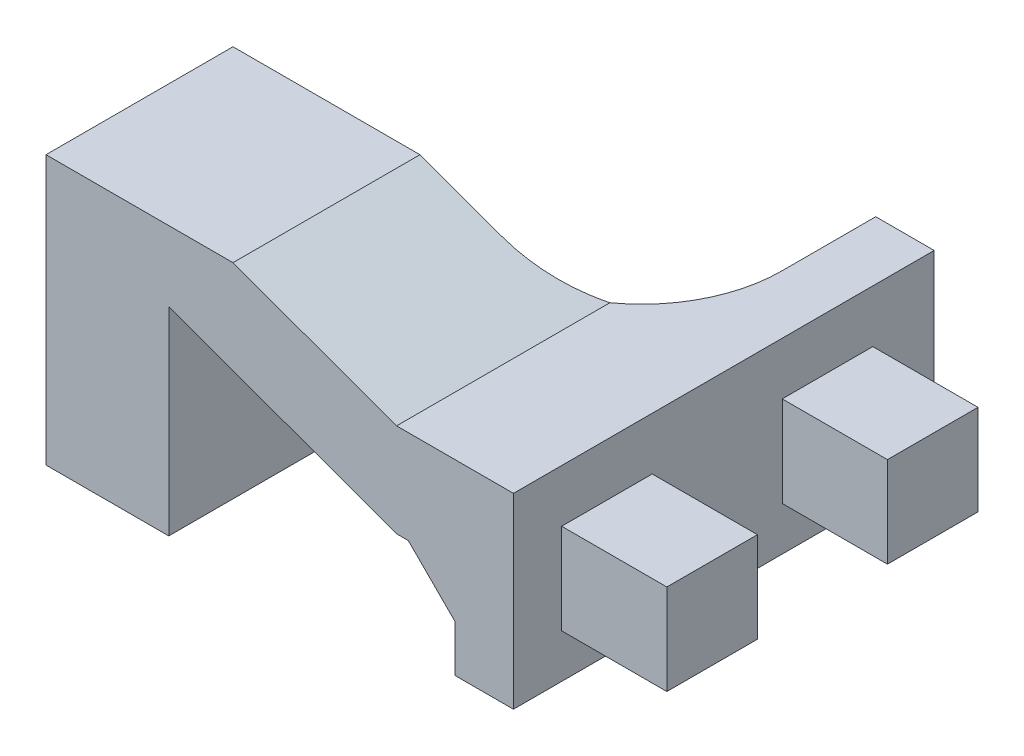
ISO-10303-21;
HEADER;
FILE_DESCRIPTION(('STEP AP214'),'2;1');
FILE_NAME('part.step','',(''),(''),'','','');
FILE_SCHEMA(('AUTOMOTIVE_DESIGN { 1 0 10303 214 1 1 1 1 }'));
ENDSEC;
DATA;
#1=APPLICATION_CONTEXT('core data for automotive mechanical design processes');
#2=APPLICATION_PROTOCOL_DEFINITION('international standard','automotive_design',2000,#1);
#3=PRODUCT_CONTEXT('',#1,'mechanical');
#4=PRODUCT('Part','Part','',(#3));
#5=PRODUCT_RELATED_PRODUCT_CATEGORY('part','',(#4));
#6=PRODUCT_DEFINITION_FORMATION('','',#4);
#7=PRODUCT_DEFINITION_CONTEXT('part definition',#1,'design');
#8=PRODUCT_DEFINITION('design','',#6,#7);
#9=PRODUCT_DEFINITION_SHAPE('','',#8);
#10=(LENGTH_UNIT() NAMED_UNIT(*) SI_UNIT(.MILLI.,.METRE.));
#11=(NAMED_UNIT(*) PLANE_ANGLE_UNIT() SI_UNIT($,.RADIAN.));
#12=(NAMED_UNIT(*) SI_UNIT($,.STERADIAN.) SOLID_ANGLE_UNIT());
#13=UNCERTAINTY_MEASURE_WITH_UNIT(LENGTH_MEASURE(1.E-05),#10,'distance_accuracy_value','');
#14=(GEOMETRIC_REPRESENTATION_CONTEXT(3) GLOBAL_UNCERTAINTY_ASSIGNED_CONTEXT((#13)) GLOBAL_UNIT_ASSIGNED_CONTEXT((#10,
#11,#12)) REPRESENTATION_CONTEXT('',''));
#15=CARTESIAN_POINT('',(0.,0.,0.));
#16=DIRECTION('',(0.,0.,1.));
#17=DIRECTION('',(1.,0.,0.));
#18=AXIS2_PLACEMENT_3D('',#15,#16,#17);
#19=CARTESIAN_POINT('',(0.,0.,-4.));
#20=DIRECTION('',(0.,0.,1.));
#21=DIRECTION('',(1.,0.,0.));
#22=AXIS2_PLACEMENT_3D('',#19,#20,#21);
#23=PLANE('',#22);
#24=DIRECTION('',(-0.939692620785908,0.34202014332567,0.));
#25=VECTOR('',#24,1.);
#26=CARTESIAN_POINT('',(3.11113986349505,8.54778652371776,-4.));
#27=LINE('',#26,#25);
#28=CARTESIAN_POINT('',(-8.5,12.7738958199317,-4.));
#29=VERTEX_POINT('',#28);
#30=CARTESIAN_POINT('',(-12.,14.0477916398634,-4.));
#31=VERTEX_POINT('',#30);
#32=EDGE_CURVE('E428',#29,#31,#27,.T.);
#33=ORIENTED_EDGE('',*,*,#32,.F.);
#34=DIRECTION('',(0.,1.,0.));
#35=VECTOR('',#34,1.);
#36=CARTESIAN_POINT('',(-8.5,5.5,-4.));
#37=LINE('',#36,#35);
#38=CARTESIAN_POINT('',(-8.5,8.77389581993171,-4.));
#39=VERTEX_POINT('',#38);
#40=EDGE_CURVE('E493',#29,#39,#37,.F.);
#41=ORIENTED_EDGE('',*,*,#40,.T.);
#42=DIRECTION('',(0.939692620785908,-0.342020143325669,0.));
#43=VECTOR('',#42,1.);
#44=CARTESIAN_POINT('',(1.82556464412197,5.01569763747982,-4.));
#45=LINE('',#44,#43);
#46=CARTESIAN_POINT('',(-14.7474774194546,11.0477916398634,-4.));
#47=VERTEX_POINT('',#46);
#48=EDGE_CURVE('E424',#47,#39,#45,.T.);
#49=ORIENTED_EDGE('',*,*,#48,.F.);
#50=DIRECTION('',(0.,1.,0.));
#51=VECTOR('',#50,1.);
#52=CARTESIAN_POINT('',(-14.7474774194546,0.,-4.));
#53=LINE('',#52,#51);
#54=CARTESIAN_POINT('',(-14.7474774194546,2.54779163986342,-4.));
#55=VERTEX_POINT('',#54);
#56=EDGE_CURVE('E420',#55,#47,#53,.T.);
#57=ORIENTED_EDGE('',*,*,#56,.F.);
#58=DIRECTION('',(1.,0.,0.));
#59=VECTOR('',#58,1.);
#60=CARTESIAN_POINT('',(0.,2.54779163986342,-4.));
#61=LINE('',#60,#59);
#62=CARTESIAN_POINT('',(-20.,2.54779163986342,-4.));
#63=VERTEX_POINT('',#62);
#64=EDGE_CURVE('E415',#63,#55,#61,.T.);
#65=ORIENTED_EDGE('',*,*,#64,.F.);
#66=DIRECTION('',(0.,-1.,0.));
#67=VECTOR('',#66,1.);
#68=CARTESIAN_POINT('',(-20.,0.,-4.));
#69=LINE('',#68,#67);
#70=CARTESIAN_POINT('',(-20.,14.0477916398634,-4.));
#71=VERTEX_POINT('',#70);
#72=EDGE_CURVE('E411',#71,#63,#69,.T.);
#73=ORIENTED_EDGE('',*,*,#72,.F.);
#74=DIRECTION('',(-1.,0.,0.));
#75=VECTOR('',#74,1.);
#76=CARTESIAN_POINT('',(0.,14.0477916398634,-4.));
#77=LINE('',#76,#75);
#78=EDGE_CURVE('E431',#31,#71,#77,.T.);
#79=ORIENTED_EDGE('',*,*,#78,.F.);
#80=EDGE_LOOP('',(#33,#41,#49,#57,#65,#73,#79));
#81=FACE_BOUND('',#80,.T.);
#82=ADVANCED_FACE('F116',(#81),#23,.F.);
#83=CARTESIAN_POINT('',(0.,11.5,-4.));
#84=DIRECTION('',(0.,1.,0.));
#85=DIRECTION('',(0.,0.,1.));
#86=AXIS2_PLACEMENT_3D('',#83,#84,#85);
#87=PLANE('',#86);
#88=DIRECTION('',(0.,0.,1.));
#89=VECTOR('',#88,1.);
#90=CARTESIAN_POINT('',(-2.5,11.5,-14.));
#91=LINE('',#90,#89);
#92=CARTESIAN_POINT('',(-2.5,11.5,-14.));
#93=VERTEX_POINT('',#92);
#94=CARTESIAN_POINT('',(-2.5,11.5,-10.));
#95=VERTEX_POINT('',#94);
#96=EDGE_CURVE('E380',#93,#95,#91,.T.);
#97=ORIENTED_EDGE('',*,*,#96,.T.);
#98=CARTESIAN_POINT('',(-8.5,11.5,-10.));
#99=DIRECTION('',(0.,1.,0.));
#100=DIRECTION('',(0.,0.,1.));
#101=AXIS2_PLACEMENT_3D('',#98,#99,#100);
#102=CIRCLE('',#101,6.);
#103=CARTESIAN_POINT('',(-5.,11.5,-5.12660282759533));
#104=VERTEX_POINT('',#103);
#105=EDGE_CURVE('E496',#95,#104,#102,.F.);
#106=ORIENTED_EDGE('',*,*,#105,.T.);
#107=DIRECTION('',(0.,0.,1.));
#108=VECTOR('',#107,1.);
#109=CARTESIAN_POINT('',(-5.,11.5,-4.));
#110=LINE('',#109,#108);
#111=CARTESIAN_POINT('',(-5.,11.5,4.));
#112=VERTEX_POINT('',#111);
#113=EDGE_CURVE('E464',#104,#112,#110,.T.);
#114=ORIENTED_EDGE('',*,*,#113,.T.);
#115=DIRECTION('',(-1.,0.,0.));
#116=VECTOR('',#115,1.);
#117=CARTESIAN_POINT('',(0.,11.5,4.));
#118=LINE('',#117,#116);
#119=CARTESIAN_POINT('',(0.,11.5,4.));
#120=VERTEX_POINT('',#119);
#121=EDGE_CURVE('E398',#120,#112,#118,.T.);
#122=ORIENTED_EDGE('',*,*,#121,.F.);
#123=DIRECTION('',(0.,0.,1.));
#124=VECTOR('',#123,1.);
#125=CARTESIAN_POINT('',(0.,11.5,-4.));
#126=LINE('',#125,#124);
#127=CARTESIAN_POINT('',(0.,11.5,-14.));
#128=VERTEX_POINT('',#127);
#129=EDGE_CURVE('E402',#128,#120,#126,.T.);
#130=ORIENTED_EDGE('',*,*,#129,.F.);
#131=DIRECTION('',(-1.,0.,0.));
#132=VECTOR('',#131,1.);
#133=CARTESIAN_POINT('',(0.,11.5,-14.));
#134=LINE('',#133,#132);
#135=EDGE_CURVE('E376',#128,#93,#134,.T.);
#136=ORIENTED_EDGE('',*,*,#135,.T.);
#137=EDGE_LOOP('',(#97,#106,#114,#122,#130,#136));
#138=FACE_BOUND('',#137,.T.);
#139=ADVANCED_FACE('F528',(#138),#87,.T.);
#140=CARTESIAN_POINT('',(0.,0.,4.));
#141=DIRECTION('',(0.,0.,1.));
#142=DIRECTION('',(1.,0.,0.));
#143=AXIS2_PLACEMENT_3D('',#140,#141,#142);
#144=PLANE('',#143);
#145=DIRECTION('',(0.,1.,0.));
#146=VECTOR('',#145,1.);
#147=CARTESIAN_POINT('',(-2.5,0.,4.));
#148=LINE('',#147,#146);
#149=CARTESIAN_POINT('',(-2.5,3.5,4.));
#150=VERTEX_POINT('',#149);
#151=CARTESIAN_POINT('',(-2.5,5.5,4.));
#152=VERTEX_POINT('',#151);
#153=EDGE_CURVE('E385',#150,#152,#148,.T.);
#154=ORIENTED_EDGE('',*,*,#153,.F.);
#155=DIRECTION('',(1.,0.,0.));
#156=VECTOR('',#155,1.);
#157=CARTESIAN_POINT('',(0.,3.5,4.));
#158=LINE('',#157,#156);
#159=CARTESIAN_POINT('',(0.,3.5,4.));
#160=VERTEX_POINT('',#159);
#161=EDGE_CURVE('E389',#150,#160,#158,.T.);
#162=ORIENTED_EDGE('',*,*,#161,.T.);
#163=DIRECTION('',(0.,1.,0.));
#164=VECTOR('',#163,1.);
#165=CARTESIAN_POINT('',(0.,0.,4.));
#166=LINE('',#165,#164);
#167=EDGE_CURVE('E394',#160,#120,#166,.T.);
#168=ORIENTED_EDGE('',*,*,#167,.T.);
#169=ORIENTED_EDGE('',*,*,#121,.T.);
#170=DIRECTION('',(-0.939692620785908,0.34202014332567,0.));
#171=VECTOR('',#170,1.);
#172=CARTESIAN_POINT('',(3.11113986349505,8.54778652371776,4.));
#173=LINE('',#172,#171);
#174=CARTESIAN_POINT('',(-12.,14.0477916398634,4.));
#175=VERTEX_POINT('',#174);
#176=EDGE_CURVE('E452',#112,#175,#173,.T.);
#177=ORIENTED_EDGE('',*,*,#176,.T.);
#178=DIRECTION('',(-1.,0.,0.));
#179=VECTOR('',#178,1.);
#180=CARTESIAN_POINT('',(0.,14.0477916398634,4.));
#181=LINE('',#180,#179);
#182=CARTESIAN_POINT('',(-20.,14.0477916398634,4.));
#183=VERTEX_POINT('',#182);
#184=EDGE_CURVE('E416',#175,#183,#181,.T.);
#185=ORIENTED_EDGE('',*,*,#184,.T.);
#186=DIRECTION('',(0.,-1.,0.));
#187=VECTOR('',#186,1.);
#188=CARTESIAN_POINT('',(-20.,0.,4.));
#189=LINE('',#188,#187);
#190=CARTESIAN_POINT('',(-20.,2.54779163986342,4.));
#191=VERTEX_POINT('',#190);
#192=EDGE_CURVE('E436',#183,#191,#189,.T.);
#193=ORIENTED_EDGE('',*,*,#192,.T.);
#194=DIRECTION('',(1.,0.,0.));
#195=VECTOR('',#194,1.);
#196=CARTESIAN_POINT('',(0.,2.54779163986342,4.));
#197=LINE('',#196,#195);
#198=CARTESIAN_POINT('',(-14.7474774194546,2.54779163986342,4.));
#199=VERTEX_POINT('',#198);
#200=EDGE_CURVE('E440',#191,#199,#197,.T.);
#201=ORIENTED_EDGE('',*,*,#200,.T.);
#202=DIRECTION('',(0.,1.,0.));
#203=VECTOR('',#202,1.);
#204=CARTESIAN_POINT('',(-14.7474774194546,0.,4.));
#205=LINE('',#204,#203);
#206=CARTESIAN_POINT('',(-14.7474774194546,11.0477916398634,4.));
#207=VERTEX_POINT('',#206);
#208=EDGE_CURVE('E444',#199,#207,#205,.T.);
#209=ORIENTED_EDGE('',*,*,#208,.T.);
#210=DIRECTION('',(0.939692620785908,-0.342020143325669,0.));
#211=VECTOR('',#210,1.);
#212=CARTESIAN_POINT('',(1.82556464412197,5.01569763747982,4.));
#213=LINE('',#212,#211);
#214=CARTESIAN_POINT('',(-5.,7.5,4.));
#215=VERTEX_POINT('',#214);
#216=EDGE_CURVE('E448',#207,#215,#213,.T.);
#217=ORIENTED_EDGE('',*,*,#216,.T.);
#218=DIRECTION('',(1.,0.,0.));
#219=VECTOR('',#218,1.);
#220=CARTESIAN_POINT('',(-5.,7.5,4.));
#221=LINE('',#220,#219);
#222=CARTESIAN_POINT('',(-4.5,7.5,4.));
#223=VERTEX_POINT('',#222);
#224=EDGE_CURVE('E384',#215,#223,#221,.T.);
#225=ORIENTED_EDGE('',*,*,#224,.T.);
#226=DIRECTION('',(0.707106781186548,-0.707106781186548,0.));
#227=VECTOR('',#226,1.);
#228=CARTESIAN_POINT('',(-4.5,7.5,4.));
#229=LINE('',#228,#227);
#230=EDGE_CURVE('E481',#223,#152,#229,.T.);
#231=ORIENTED_EDGE('',*,*,#230,.T.);
#232=EDGE_LOOP('',(#154,#162,#168,#169,#177,#185,#193,#201,#209,#217,#225,#231));
#233=FACE_BOUND('',#232,.T.);
#234=ADVANCED_FACE('F516',(#233),#144,.T.);
#235=CARTESIAN_POINT('',(0.,0.,-4.));
#236=DIRECTION('',(1.,0.,0.));
#237=DIRECTION('',(0.,0.,-1.));
#238=AXIS2_PLACEMENT_3D('',#235,#236,#237);
#239=PLANE('',#238);
#240=DIRECTION('',(0.,1.,0.));
#241=VECTOR('',#240,1.);
#242=CARTESIAN_POINT('',(0.,0.,-7.5));
#243=LINE('',#242,#241);
#244=CARTESIAN_POINT('',(0.,5.375,-7.5));
#245=VERTEX_POINT('',#244);
#246=CARTESIAN_POINT('',(0.,9.25,-7.5));
#247=VERTEX_POINT('',#246);
#248=EDGE_CURVE('E287',#245,#247,#243,.T.);
#249=ORIENTED_EDGE('',*,*,#248,.T.);
#250=DIRECTION('',(0.,0.,-1.));
#251=VECTOR('',#250,1.);
#252=CARTESIAN_POINT('',(0.,9.25,-7.5));
#253=LINE('',#252,#251);
#254=CARTESIAN_POINT('',(0.,9.25,-11.375));
#255=VERTEX_POINT('',#254);
#256=EDGE_CURVE('E316',#247,#255,#253,.T.);
#257=ORIENTED_EDGE('',*,*,#256,.T.);
#258=DIRECTION('',(0.,1.,0.));
#259=VECTOR('',#258,1.);
#260=CARTESIAN_POINT('',(0.,0.,-11.375));
#261=LINE('',#260,#259);
#262=CARTESIAN_POINT('',(0.,5.375,-11.375));
#263=VERTEX_POINT('',#262);
#264=EDGE_CURVE('E290',#263,#255,#261,.T.);
#265=ORIENTED_EDGE('',*,*,#264,.F.);
#266=DIRECTION('',(0.,0.,-1.));
#267=VECTOR('',#266,1.);
#268=CARTESIAN_POINT('',(0.,5.375,-7.5));
#269=LINE('',#268,#267);
#270=EDGE_CURVE('E301',#245,#263,#269,.T.);
#271=ORIENTED_EDGE('',*,*,#270,.F.);
#272=EDGE_LOOP('',(#249,#257,#265,#271));
#273=FACE_BOUND('',#272,.T.);
#274=DIRECTION('',(0.,1.,0.));
#275=VECTOR('',#274,1.);
#276=CARTESIAN_POINT('',(0.,0.,1.9375));
#277=LINE('',#276,#275);
#278=CARTESIAN_POINT('',(0.,5.375,1.9375));
#279=VERTEX_POINT('',#278);
#280=CARTESIAN_POINT('',(0.,9.25,1.9375));
#281=VERTEX_POINT('',#280);
#282=EDGE_CURVE('E334',#279,#281,#277,.T.);
#283=ORIENTED_EDGE('',*,*,#282,.T.);
#284=DIRECTION('',(0.,0.,-1.));
#285=VECTOR('',#284,1.);
#286=CARTESIAN_POINT('',(0.,9.25,1.9375));
#287=LINE('',#286,#285);
#288=CARTESIAN_POINT('',(0.,9.25,-1.9375));
#289=VERTEX_POINT('',#288);
#290=EDGE_CURVE('E355',#281,#289,#287,.T.);
#291=ORIENTED_EDGE('',*,*,#290,.T.);
#292=DIRECTION('',(0.,1.,0.));
#293=VECTOR('',#292,1.);
#294=CARTESIAN_POINT('',(0.,0.,-1.9375));
#295=LINE('',#294,#293);
#296=CARTESIAN_POINT('',(0.,5.375,-1.9375));
#297=VERTEX_POINT('',#296);
#298=EDGE_CURVE('E326',#297,#289,#295,.T.);
#299=ORIENTED_EDGE('',*,*,#298,.F.);
#300=DIRECTION('',(0.,0.,-1.));
#301=VECTOR('',#300,1.);
#302=CARTESIAN_POINT('',(0.,5.375,1.9375));
#303=LINE('',#302,#301);
#304=EDGE_CURVE('E338',#279,#297,#303,.T.);
#305=ORIENTED_EDGE('',*,*,#304,.F.);
#306=EDGE_LOOP('',(#283,#291,#299,#305));
#307=FACE_BOUND('',#306,.T.);
#308=ORIENTED_EDGE('',*,*,#167,.F.);
#309=DIRECTION('',(0.,0.,1.));
#310=VECTOR('',#309,1.);
#311=CARTESIAN_POINT('',(0.,3.5,-4.));
#312=LINE('',#311,#310);
#313=CARTESIAN_POINT('',(0.,3.5,-14.));
#314=VERTEX_POINT('',#313);
#315=EDGE_CURVE('E406',#314,#160,#312,.T.);
#316=ORIENTED_EDGE('',*,*,#315,.F.);
#317=DIRECTION('',(0.,1.,0.));
#318=VECTOR('',#317,1.);
#319=CARTESIAN_POINT('',(0.,0.,-14.));
#320=LINE('',#319,#318);
#321=EDGE_CURVE('E372',#314,#128,#320,.T.);
#322=ORIENTED_EDGE('',*,*,#321,.T.);
#323=ORIENTED_EDGE('',*,*,#129,.T.);
#324=EDGE_LOOP('',(#308,#316,#322,#323));
#325=FACE_BOUND('',#324,.T.);
#326=ADVANCED_FACE('F563',(#273,#307,#325),#239,.T.);
#327=CARTESIAN_POINT('',(0.,3.5,-4.));
#328=DIRECTION('',(0.,-1.,0.));
#329=DIRECTION('',(0.,0.,-1.));
#330=AXIS2_PLACEMENT_3D('',#327,#328,#329);
#331=PLANE('',#330);
#332=ORIENTED_EDGE('',*,*,#161,.F.);
#333=DIRECTION('',(0.,0.,1.));
#334=VECTOR('',#333,1.);
#335=CARTESIAN_POINT('',(-2.5,3.5,-4.));
#336=LINE('',#335,#334);
#337=CARTESIAN_POINT('',(-2.5,3.5,-14.));
#338=VERTEX_POINT('',#337);
#339=EDGE_CURVE('E401',#338,#150,#336,.T.);
#340=ORIENTED_EDGE('',*,*,#339,.F.);
#341=DIRECTION('',(1.,0.,0.));
#342=VECTOR('',#341,1.);
#343=CARTESIAN_POINT('',(0.,3.5,-14.));
#344=LINE('',#343,#342);
#345=EDGE_CURVE('E368',#338,#314,#344,.T.);
#346=ORIENTED_EDGE('',*,*,#345,.T.);
#347=ORIENTED_EDGE('',*,*,#315,.T.);
#348=EDGE_LOOP('',(#332,#340,#346,#347));
#349=FACE_BOUND('',#348,.T.);
#350=ADVANCED_FACE('F523',(#349),#331,.T.);
#351=CARTESIAN_POINT('',(-2.5,0.,-4.));
#352=DIRECTION('',(1.,0.,0.));
#353=DIRECTION('',(0.,1.,0.));
#354=AXIS2_PLACEMENT_3D('',#351,#352,#353);
#355=PLANE('',#354);
#356=DIRECTION('',(0.,0.,1.));
#357=VECTOR('',#356,1.);
#358=CARTESIAN_POINT('',(-2.5,5.5,-4.));
#359=LINE('',#358,#357);
#360=CARTESIAN_POINT('',(-2.5,5.5,-10.));
#361=VERTEX_POINT('',#360);
#362=EDGE_CURVE('E405',#361,#152,#359,.T.);
#363=ORIENTED_EDGE('',*,*,#362,.F.);
#364=DIRECTION('',(0.,1.,0.));
#365=VECTOR('',#364,1.);
#366=CARTESIAN_POINT('',(-2.5,11.5,-10.));
#367=LINE('',#366,#365);
#368=EDGE_CURVE('E487',#361,#95,#367,.T.);
#369=ORIENTED_EDGE('',*,*,#368,.T.);
#370=ORIENTED_EDGE('',*,*,#96,.F.);
#371=DIRECTION('',(0.,1.,0.));
#372=VECTOR('',#371,1.);
#373=CARTESIAN_POINT('',(-2.5,0.,-14.));
#374=LINE('',#373,#372);
#375=EDGE_CURVE('E365',#338,#93,#374,.T.);
#376=ORIENTED_EDGE('',*,*,#375,.F.);
#377=ORIENTED_EDGE('',*,*,#339,.T.);
#378=ORIENTED_EDGE('',*,*,#153,.T.);
#379=EDGE_LOOP('',(#363,#369,#370,#376,#377,#378));
#380=FACE_BOUND('',#379,.T.);
#381=ADVANCED_FACE('F518',(#380),#355,.F.);
#382=CARTESIAN_POINT('',(0.,14.0477916398634,-4.));
#383=DIRECTION('',(0.,1.,0.));
#384=DIRECTION('',(-1.,0.,0.));
#385=AXIS2_PLACEMENT_3D('',#382,#383,#384);
#386=PLANE('',#385);
#387=ORIENTED_EDGE('',*,*,#184,.F.);
#388=DIRECTION('',(0.,0.,1.));
#389=VECTOR('',#388,1.);
#390=CARTESIAN_POINT('',(-12.,14.0477916398634,-4.));
#391=LINE('',#390,#389);
#392=EDGE_CURVE('E461',#31,#175,#391,.T.);
#393=ORIENTED_EDGE('',*,*,#392,.F.);
#394=ORIENTED_EDGE('',*,*,#78,.T.);
#395=DIRECTION('',(0.,0.,1.));
#396=VECTOR('',#395,1.);
#397=CARTESIAN_POINT('',(-20.,14.0477916398634,-4.));
#398=LINE('',#397,#396);
#399=EDGE_CURVE('E390',#71,#183,#398,.T.);
#400=ORIENTED_EDGE('',*,*,#399,.T.);
#401=EDGE_LOOP('',(#387,#393,#394,#400));
#402=FACE_BOUND('',#401,.T.);
#403=ADVANCED_FACE('F536',(#402),#386,.T.);
#404=CARTESIAN_POINT('',(1.82556464412197,5.01569763747982,-4.));
#405=DIRECTION('',(-0.342020143325669,-0.939692620785908,0.));
#406=DIRECTION('',(0.939692620785908,-0.342020143325669,0.));
#407=AXIS2_PLACEMENT_3D('',#404,#405,#406);
#408=PLANE('',#407);
#409=ORIENTED_EDGE('',*,*,#216,.F.);
#410=DIRECTION('',(0.,0.,1.));
#411=VECTOR('',#410,1.);
#412=CARTESIAN_POINT('',(-14.7474774194546,11.0477916398634,-4.));
#413=LINE('',#412,#411);
#414=EDGE_CURVE('E470',#47,#207,#413,.T.);
#415=ORIENTED_EDGE('',*,*,#414,.F.);
#416=ORIENTED_EDGE('',*,*,#48,.T.);
#417=CARTESIAN_POINT('',(-8.5,8.77389581993171,-10.));
#418=DIRECTION('',(-0.342020143325669,-0.939692620785908,0.));
#419=DIRECTION('',(0.939692620785908,-0.342020143325669,0.));
#420=AXIS2_PLACEMENT_3D('',#417,#418,#419);
#421=ELLIPSE('',#420,6.38506663485547,6.);
#422=CARTESIAN_POINT('',(-5.,7.5,-5.12660282759533));
#423=VERTEX_POINT('',#422);
#424=EDGE_CURVE('E503',#39,#423,#421,.F.);
#425=ORIENTED_EDGE('',*,*,#424,.T.);
#426=DIRECTION('',(0.,0.,1.));
#427=VECTOR('',#426,1.);
#428=CARTESIAN_POINT('',(-5.,7.5,-4.));
#429=LINE('',#428,#427);
#430=EDGE_CURVE('E138',#423,#215,#429,.T.);
#431=ORIENTED_EDGE('',*,*,#430,.T.);
#432=EDGE_LOOP('',(#409,#415,#416,#425,#431));
#433=FACE_BOUND('',#432,.T.);
#434=ADVANCED_FACE('F553',(#433),#408,.T.);
#435=CARTESIAN_POINT('',(-14.7474774194546,0.,-4.));
#436=DIRECTION('',(1.,0.,0.));
#437=DIRECTION('',(0.,1.,0.));
#438=AXIS2_PLACEMENT_3D('',#435,#436,#437);
#439=PLANE('',#438);
#440=ORIENTED_EDGE('',*,*,#208,.F.);
#441=DIRECTION('',(0.,0.,1.));
#442=VECTOR('',#441,1.);
#443=CARTESIAN_POINT('',(-14.7474774194546,2.54779163986342,-4.));
#444=LINE('',#443,#442);
#445=EDGE_CURVE('E473',#55,#199,#444,.T.);
#446=ORIENTED_EDGE('',*,*,#445,.F.);
#447=ORIENTED_EDGE('',*,*,#56,.T.);
#448=ORIENTED_EDGE('',*,*,#414,.T.);
#449=EDGE_LOOP('',(#440,#446,#447,#448));
#450=FACE_BOUND('',#449,.T.);
#451=ADVANCED_FACE('F549',(#450),#439,.T.);
#452=CARTESIAN_POINT('',(0.,2.54779163986342,-4.));
#453=DIRECTION('',(0.,-1.,0.));
#454=DIRECTION('',(0.,0.,-1.));
#455=AXIS2_PLACEMENT_3D('',#452,#453,#454);
#456=PLANE('',#455);
#457=ORIENTED_EDGE('',*,*,#200,.F.);
#458=DIRECTION('',(0.,0.,1.));
#459=VECTOR('',#458,1.);
#460=CARTESIAN_POINT('',(-20.,2.54779163986342,-4.));
#461=LINE('',#460,#459);
#462=EDGE_CURVE('E435',#63,#191,#461,.T.);
#463=ORIENTED_EDGE('',*,*,#462,.F.);
#464=ORIENTED_EDGE('',*,*,#64,.T.);
#465=ORIENTED_EDGE('',*,*,#445,.T.);
#466=EDGE_LOOP('',(#457,#463,#464,#465));
#467=FACE_BOUND('',#466,.T.);
#468=ADVANCED_FACE('F545',(#467),#456,.T.);
#469=CARTESIAN_POINT('',(-20.,0.,-4.));
#470=DIRECTION('',(-1.,0.,0.));
#471=DIRECTION('',(0.,-1.,0.));
#472=AXIS2_PLACEMENT_3D('',#469,#470,#471);
#473=PLANE('',#472);
#474=ORIENTED_EDGE('',*,*,#192,.F.);
#475=ORIENTED_EDGE('',*,*,#399,.F.);
#476=ORIENTED_EDGE('',*,*,#72,.T.);
#477=ORIENTED_EDGE('',*,*,#462,.T.);
#478=EDGE_LOOP('',(#474,#475,#476,#477));
#479=FACE_BOUND('',#478,.T.);
#480=ADVANCED_FACE('F541',(#479),#473,.T.);
#481=CARTESIAN_POINT('',(3.11113986349505,8.54778652371776,-4.));
#482=DIRECTION('',(0.342020143325669,0.939692620785908,0.));
#483=DIRECTION('',(-0.939692620785908,0.342020143325669,0.));
#484=AXIS2_PLACEMENT_3D('',#481,#482,#483);
#485=PLANE('',#484);
#486=ORIENTED_EDGE('',*,*,#176,.F.);
#487=ORIENTED_EDGE('',*,*,#113,.F.);
#488=CARTESIAN_POINT('',(-8.5,12.7738958199317,-10.));
#489=DIRECTION('',(0.342020143325669,0.939692620785908,0.));
#490=DIRECTION('',(0.939692620785908,-0.342020143325669,0.));
#491=AXIS2_PLACEMENT_3D('',#488,#489,#490);
#492=ELLIPSE('',#491,6.38506663485548,6.);
#493=EDGE_CURVE('E500',#104,#29,#492,.F.);
#494=ORIENTED_EDGE('',*,*,#493,.T.);
#495=ORIENTED_EDGE('',*,*,#32,.T.);
#496=ORIENTED_EDGE('',*,*,#392,.T.);
#497=EDGE_LOOP('',(#486,#487,#494,#495,#496));
#498=FACE_BOUND('',#497,.T.);
#499=ADVANCED_FACE('F532',(#498),#485,.T.);
#500=CARTESIAN_POINT('',(-5.,7.5,-4.));
#501=DIRECTION('',(0.,-1.,0.));
#502=DIRECTION('',(0.,0.,-1.));
#503=AXIS2_PLACEMENT_3D('',#500,#501,#502);
#504=PLANE('',#503);
#505=ORIENTED_EDGE('',*,*,#224,.F.);
#506=ORIENTED_EDGE('',*,*,#430,.F.);
#507=CARTESIAN_POINT('',(-8.5,7.5,-10.));
#508=DIRECTION('',(0.,-1.,0.));
#509=DIRECTION('',(0.,0.,-1.));
#510=AXIS2_PLACEMENT_3D('',#507,#508,#509);
#511=CIRCLE('',#510,6.);
#512=CARTESIAN_POINT('',(-4.5,7.5,-5.52786404500042));
#513=VERTEX_POINT('',#512);
#514=EDGE_CURVE('E125',#423,#513,#511,.F.);
#515=ORIENTED_EDGE('',*,*,#514,.T.);
#516=DIRECTION('',(0.,0.,1.));
#517=VECTOR('',#516,1.);
#518=CARTESIAN_POINT('',(-4.5,7.5,-4.));
#519=LINE('',#518,#517);
#520=EDGE_CURVE('E131',#513,#223,#519,.T.);
#521=ORIENTED_EDGE('',*,*,#520,.T.);
#522=EDGE_LOOP('',(#505,#506,#515,#521));
#523=FACE_BOUND('',#522,.T.);
#524=ADVANCED_FACE('F508',(#523),#504,.T.);
#525=CARTESIAN_POINT('',(-4.5,7.5,-4.));
#526=DIRECTION('',(-0.707106781186548,-0.707106781186547,0.));
#527=DIRECTION('',(0.707106781186547,-0.707106781186548,0.));
#528=AXIS2_PLACEMENT_3D('',#525,#526,#527);
#529=PLANE('',#528);
#530=ORIENTED_EDGE('',*,*,#230,.F.);
#531=ORIENTED_EDGE('',*,*,#520,.F.);
#532=CARTESIAN_POINT('',(-8.5,11.5,-10.));
#533=DIRECTION('',(-0.707106781186548,-0.707106781186547,0.));
#534=DIRECTION('',(0.707106781186547,-0.707106781186548,0.));
#535=AXIS2_PLACEMENT_3D('',#532,#533,#534);
#536=ELLIPSE('',#535,8.48528137423857,6.);
#537=EDGE_CURVE('E12',#513,#361,#536,.F.);
#538=ORIENTED_EDGE('',*,*,#537,.T.);
#539=ORIENTED_EDGE('',*,*,#362,.T.);
#540=EDGE_LOOP('',(#530,#531,#538,#539));
#541=FACE_BOUND('',#540,.T.);
#542=ADVANCED_FACE('F512',(#541),#529,.T.);
#543=CARTESIAN_POINT('',(0.,0.,-14.));
#544=DIRECTION('',(0.,0.,1.));
#545=DIRECTION('',(1.,0.,0.));
#546=AXIS2_PLACEMENT_3D('',#543,#544,#545);
#547=PLANE('',#546);
#548=ORIENTED_EDGE('',*,*,#375,.T.);
#549=ORIENTED_EDGE('',*,*,#135,.F.);
#550=ORIENTED_EDGE('',*,*,#321,.F.);
#551=ORIENTED_EDGE('',*,*,#345,.F.);
#552=EDGE_LOOP('',(#548,#549,#550,#551));
#553=FACE_BOUND('',#552,.T.);
#554=ADVANCED_FACE('F577',(#553),#547,.F.);
#555=CARTESIAN_POINT('',(0.,5.375,1.9375));
#556=DIRECTION('',(0.,-1.,0.));
#557=DIRECTION('',(0.,0.,-1.));
#558=AXIS2_PLACEMENT_3D('',#555,#556,#557);
#559=PLANE('',#558);
#560=DIRECTION('',(-1.,0.,0.));
#561=VECTOR('',#560,1.);
#562=CARTESIAN_POINT('',(0.,5.375,-1.9375));
#563=LINE('',#562,#561);
#564=CARTESIAN_POINT('',(4.5,5.375,-1.9375));
#565=VERTEX_POINT('',#564);
#566=EDGE_CURVE('E277',#565,#297,#563,.T.);
#567=ORIENTED_EDGE('',*,*,#566,.F.);
#568=DIRECTION('',(0.,0.,-1.));
#569=VECTOR('',#568,1.);
#570=CARTESIAN_POINT('',(4.5,5.375,1.9375));
#571=LINE('',#570,#569);
#572=CARTESIAN_POINT('',(4.5,5.375,1.9375));
#573=VERTEX_POINT('',#572);
#574=EDGE_CURVE('E362',#573,#565,#571,.T.);
#575=ORIENTED_EDGE('',*,*,#574,.F.);
#576=DIRECTION('',(-1.,0.,0.));
#577=VECTOR('',#576,1.);
#578=CARTESIAN_POINT('',(0.,5.375,1.9375));
#579=LINE('',#578,#577);
#580=EDGE_CURVE('E322',#573,#279,#579,.T.);
#581=ORIENTED_EDGE('',*,*,#580,.T.);
#582=ORIENTED_EDGE('',*,*,#304,.T.);
#583=EDGE_LOOP('',(#567,#575,#581,#582));
#584=FACE_BOUND('',#583,.T.);
#585=ADVANCED_FACE('F607',(#584),#559,.T.);
#586=CARTESIAN_POINT('',(4.5,0.,1.9375));
#587=DIRECTION('',(1.,0.,0.));
#588=DIRECTION('',(0.,1.,0.));
#589=AXIS2_PLACEMENT_3D('',#586,#587,#588);
#590=PLANE('',#589);
#591=DIRECTION('',(0.,-1.,0.));
#592=VECTOR('',#591,1.);
#593=CARTESIAN_POINT('',(4.5,0.,-1.9375));
#594=LINE('',#593,#592);
#595=CARTESIAN_POINT('',(4.5,9.25,-1.9375));
#596=VERTEX_POINT('',#595);
#597=EDGE_CURVE('E341',#596,#565,#594,.T.);
#598=ORIENTED_EDGE('',*,*,#597,.F.);
#599=DIRECTION('',(0.,0.,-1.));
#600=VECTOR('',#599,1.);
#601=CARTESIAN_POINT('',(4.5,9.25,1.9375));
#602=LINE('',#601,#600);
#603=CARTESIAN_POINT('',(4.5,9.25,1.9375));
#604=VERTEX_POINT('',#603);
#605=EDGE_CURVE('E359',#604,#596,#602,.T.);
#606=ORIENTED_EDGE('',*,*,#605,.F.);
#607=DIRECTION('',(0.,-1.,0.));
#608=VECTOR('',#607,1.);
#609=CARTESIAN_POINT('',(4.5,0.,1.9375));
#610=LINE('',#609,#608);
#611=EDGE_CURVE('E325',#604,#573,#610,.T.);
#612=ORIENTED_EDGE('',*,*,#611,.T.);
#613=ORIENTED_EDGE('',*,*,#574,.T.);
#614=EDGE_LOOP('',(#598,#606,#612,#613));
#615=FACE_BOUND('',#614,.T.);
#616=ADVANCED_FACE('F615',(#615),#590,.T.);
#617=CARTESIAN_POINT('',(0.,9.25,1.9375));
#618=DIRECTION('',(0.,1.,0.));
#619=DIRECTION('',(0.,0.,1.));
#620=AXIS2_PLACEMENT_3D('',#617,#618,#619);
#621=PLANE('',#620);
#622=DIRECTION('',(1.,0.,0.));
#623=VECTOR('',#622,1.);
#624=CARTESIAN_POINT('',(0.,9.25,-1.9375));
#625=LINE('',#624,#623);
#626=EDGE_CURVE('E345',#289,#596,#625,.T.);
#627=ORIENTED_EDGE('',*,*,#626,.F.);
#628=ORIENTED_EDGE('',*,*,#290,.F.);
#629=DIRECTION('',(1.,0.,0.));
#630=VECTOR('',#629,1.);
#631=CARTESIAN_POINT('',(0.,9.25,1.9375));
#632=LINE('',#631,#630);
#633=EDGE_CURVE('E330',#281,#604,#632,.T.);
#634=ORIENTED_EDGE('',*,*,#633,.T.);
#635=ORIENTED_EDGE('',*,*,#605,.T.);
#636=EDGE_LOOP('',(#627,#628,#634,#635));
#637=FACE_BOUND('',#636,.T.);
#638=ADVANCED_FACE('F623',(#637),#621,.T.);
#639=CARTESIAN_POINT('',(0.,0.,1.9375));
#640=DIRECTION('',(0.,0.,1.));
#641=DIRECTION('',(1.,0.,0.));
#642=AXIS2_PLACEMENT_3D('',#639,#640,#641);
#643=PLANE('',#642);
#644=ORIENTED_EDGE('',*,*,#580,.F.);
#645=ORIENTED_EDGE('',*,*,#611,.F.);
#646=ORIENTED_EDGE('',*,*,#633,.F.);
#647=ORIENTED_EDGE('',*,*,#282,.F.);
#648=EDGE_LOOP('',(#644,#645,#646,#647));
#649=FACE_BOUND('',#648,.T.);
#650=ADVANCED_FACE('F631',(#649),#643,.T.);
#651=CARTESIAN_POINT('',(0.,0.,-1.9375));
#652=DIRECTION('',(0.,0.,1.));
#653=DIRECTION('',(1.,0.,0.));
#654=AXIS2_PLACEMENT_3D('',#651,#652,#653);
#655=PLANE('',#654);
#656=ORIENTED_EDGE('',*,*,#566,.T.);
#657=ORIENTED_EDGE('',*,*,#298,.T.);
#658=ORIENTED_EDGE('',*,*,#626,.T.);
#659=ORIENTED_EDGE('',*,*,#597,.T.);
#660=EDGE_LOOP('',(#656,#657,#658,#659));
#661=FACE_BOUND('',#660,.T.);
#662=ADVANCED_FACE('F639',(#661),#655,.F.);
#663=CARTESIAN_POINT('',(0.,5.375,-7.5));
#664=DIRECTION('',(0.,-1.,0.));
#665=DIRECTION('',(0.,0.,-1.));
#666=AXIS2_PLACEMENT_3D('',#663,#664,#665);
#667=PLANE('',#666);
#668=DIRECTION('',(-1.,0.,0.));
#669=VECTOR('',#668,1.);
#670=CARTESIAN_POINT('',(0.,5.375,-11.375));
#671=LINE('',#670,#669);
#672=CARTESIAN_POINT('',(4.5,5.375,-11.375));
#673=VERTEX_POINT('',#672);
#674=EDGE_CURVE('E271',#673,#263,#671,.T.);
#675=ORIENTED_EDGE('',*,*,#674,.F.);
#676=DIRECTION('',(0.,0.,-1.));
#677=VECTOR('',#676,1.);
#678=CARTESIAN_POINT('',(4.5,5.375,-7.5));
#679=LINE('',#678,#677);
#680=CARTESIAN_POINT('',(4.5,5.375,-7.5));
#681=VERTEX_POINT('',#680);
#682=EDGE_CURVE('E265',#681,#673,#679,.T.);
#683=ORIENTED_EDGE('',*,*,#682,.F.);
#684=DIRECTION('',(-1.,0.,0.));
#685=VECTOR('',#684,1.);
#686=CARTESIAN_POINT('',(0.,5.375,-7.5));
#687=LINE('',#686,#685);
#688=EDGE_CURVE('E269',#681,#245,#687,.T.);
#689=ORIENTED_EDGE('',*,*,#688,.T.);
#690=ORIENTED_EDGE('',*,*,#270,.T.);
#691=EDGE_LOOP('',(#675,#683,#689,#690));
#692=FACE_BOUND('',#691,.T.);
#693=ADVANCED_FACE('F267',(#692),#667,.T.);
#694=CARTESIAN_POINT('',(4.5,0.,-7.5));
#695=DIRECTION('',(1.,0.,0.));
#696=DIRECTION('',(0.,1.,0.));
#697=AXIS2_PLACEMENT_3D('',#694,#695,#696);
#698=PLANE('',#697);
#699=DIRECTION('',(0.,-1.,0.));
#700=VECTOR('',#699,1.);
#701=CARTESIAN_POINT('',(4.5,0.,-11.375));
#702=LINE('',#701,#700);
#703=CARTESIAN_POINT('',(4.5,9.25,-11.375));
#704=VERTEX_POINT('',#703);
#705=EDGE_CURVE('E304',#704,#673,#702,.T.);
#706=ORIENTED_EDGE('',*,*,#705,.F.);
#707=DIRECTION('',(0.,0.,-1.));
#708=VECTOR('',#707,1.);
#709=CARTESIAN_POINT('',(4.5,9.25,-7.5));
#710=LINE('',#709,#708);
#711=CARTESIAN_POINT('',(4.5,9.25,-7.5));
#712=VERTEX_POINT('',#711);
#713=EDGE_CURVE('E278',#712,#704,#710,.T.);
#714=ORIENTED_EDGE('',*,*,#713,.F.);
#715=DIRECTION('',(0.,-1.,0.));
#716=VECTOR('',#715,1.);
#717=CARTESIAN_POINT('',(4.5,0.,-7.5));
#718=LINE('',#717,#716);
#719=EDGE_CURVE('E284',#712,#681,#718,.T.);
#720=ORIENTED_EDGE('',*,*,#719,.T.);
#721=ORIENTED_EDGE('',*,*,#682,.T.);
#722=EDGE_LOOP('',(#706,#714,#720,#721));
#723=FACE_BOUND('',#722,.T.);
#724=ADVANCED_FACE('F292',(#723),#698,.T.);
#725=CARTESIAN_POINT('',(0.,9.25,-7.5));
#726=DIRECTION('',(0.,1.,0.));
#727=DIRECTION('',(0.,0.,1.));
#728=AXIS2_PLACEMENT_3D('',#725,#726,#727);
#729=PLANE('',#728);
#730=DIRECTION('',(1.,0.,0.));
#731=VECTOR('',#730,1.);
#732=CARTESIAN_POINT('',(0.,9.25,-11.375));
#733=LINE('',#732,#731);
#734=EDGE_CURVE('E307',#255,#704,#733,.T.);
#735=ORIENTED_EDGE('',*,*,#734,.F.);
#736=ORIENTED_EDGE('',*,*,#256,.F.);
#737=DIRECTION('',(1.,0.,0.));
#738=VECTOR('',#737,1.);
#739=CARTESIAN_POINT('',(0.,9.25,-7.5));
#740=LINE('',#739,#738);
#741=EDGE_CURVE('E294',#247,#712,#740,.T.);
#742=ORIENTED_EDGE('',*,*,#741,.T.);
#743=ORIENTED_EDGE('',*,*,#713,.T.);
#744=EDGE_LOOP('',(#735,#736,#742,#743));
#745=FACE_BOUND('',#744,.T.);
#746=ADVANCED_FACE('F661',(#745),#729,.T.);
#747=CARTESIAN_POINT('',(0.,0.,-7.5));
#748=DIRECTION('',(0.,0.,1.));
#749=DIRECTION('',(1.,0.,0.));
#750=AXIS2_PLACEMENT_3D('',#747,#748,#749);
#751=PLANE('',#750);
#752=ORIENTED_EDGE('',*,*,#688,.F.);
#753=ORIENTED_EDGE('',*,*,#719,.F.);
#754=ORIENTED_EDGE('',*,*,#741,.F.);
#755=ORIENTED_EDGE('',*,*,#248,.F.);
#756=EDGE_LOOP('',(#752,#753,#754,#755));
#757=FACE_BOUND('',#756,.T.);
#758=ADVANCED_FACE('F282',(#757),#751,.T.);
#759=CARTESIAN_POINT('',(0.,0.,-11.375));
#760=DIRECTION('',(0.,0.,1.));
#761=DIRECTION('',(1.,0.,0.));
#762=AXIS2_PLACEMENT_3D('',#759,#760,#761);
#763=PLANE('',#762);
#764=ORIENTED_EDGE('',*,*,#674,.T.);
#765=ORIENTED_EDGE('',*,*,#264,.T.);
#766=ORIENTED_EDGE('',*,*,#734,.T.);
#767=ORIENTED_EDGE('',*,*,#705,.T.);
#768=EDGE_LOOP('',(#764,#765,#766,#767));
#769=FACE_BOUND('',#768,.T.);
#770=ADVANCED_FACE('F675',(#769),#763,.F.);
#771=CARTESIAN_POINT('',(-8.5,0.,-10.));
#772=DIRECTION('',(0.,-1.,0.));
#773=DIRECTION('',(1.,0.,0.));
#774=AXIS2_PLACEMENT_3D('',#771,#772,#773);
#775=CYLINDRICAL_SURFACE('',#774,6.);
#776=ORIENTED_EDGE('',*,*,#424,.F.);
#777=ORIENTED_EDGE('',*,*,#40,.F.);
#778=ORIENTED_EDGE('',*,*,#493,.F.);
#779=ORIENTED_EDGE('',*,*,#105,.F.);
#780=ORIENTED_EDGE('',*,*,#368,.F.);
#781=ORIENTED_EDGE('',*,*,#537,.F.);
#782=ORIENTED_EDGE('',*,*,#514,.F.);
#783=EDGE_LOOP('',(#776,#777,#778,#779,#780,#781,#782));
#784=FACE_BOUND('',#783,.T.);
#785=ADVANCED_FACE('F118',(#784),#775,.F.);
#786=CLOSED_SHELL('',(#82,#139,#234,#326,#350,#381,#403,#434,#451,#468,#480,#499,#524,#542,#554,
#585,#616,#638,#650,#662,#693,#724,#746,#758,#770,#785));
#787=MANIFOLD_SOLID_BREP('B2',#786);
#788=ADVANCED_BREP_SHAPE_REPRESENTATION('',(#18,#787),#14);
#789=SHAPE_DEFINITION_REPRESENTATION(#9,#788);
ENDSEC;
END-ISO-10303-21;
